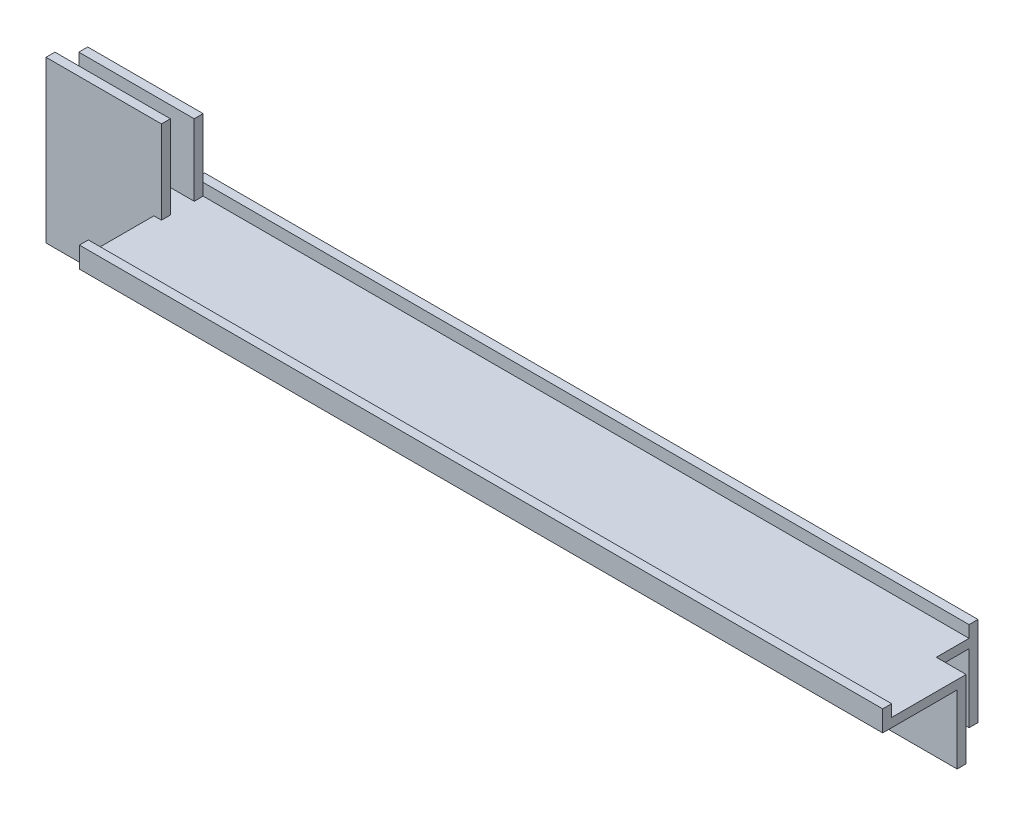
ISO-10303-21;
HEADER;
FILE_DESCRIPTION(('STEP AP214'),'2;1');
FILE_NAME('part.step','',(''),(''),'','','');
FILE_SCHEMA(('AUTOMOTIVE_DESIGN { 1 0 10303 214 1 1 1 1 }'));
ENDSEC;
DATA;
#1=APPLICATION_CONTEXT('core data for automotive mechanical design processes');
#2=APPLICATION_PROTOCOL_DEFINITION('international standard','automotive_design',2000,#1);
#3=PRODUCT_CONTEXT('',#1,'mechanical');
#4=PRODUCT('Part','Part','',(#3));
#5=PRODUCT_RELATED_PRODUCT_CATEGORY('part','',(#4));
#6=PRODUCT_DEFINITION_FORMATION('','',#4);
#7=PRODUCT_DEFINITION_CONTEXT('part definition',#1,'design');
#8=PRODUCT_DEFINITION('design','',#6,#7);
#9=PRODUCT_DEFINITION_SHAPE('','',#8);
#10=(LENGTH_UNIT() NAMED_UNIT(*) SI_UNIT(.MILLI.,.METRE.));
#11=(NAMED_UNIT(*) PLANE_ANGLE_UNIT() SI_UNIT($,.RADIAN.));
#12=(NAMED_UNIT(*) SI_UNIT($,.STERADIAN.) SOLID_ANGLE_UNIT());
#13=UNCERTAINTY_MEASURE_WITH_UNIT(LENGTH_MEASURE(1.E-05),#10,'distance_accuracy_value','');
#14=(GEOMETRIC_REPRESENTATION_CONTEXT(3) GLOBAL_UNCERTAINTY_ASSIGNED_CONTEXT((#13)) GLOBAL_UNIT_ASSIGNED_CONTEXT((#10,
#11,#12)) REPRESENTATION_CONTEXT('',''));
#15=CARTESIAN_POINT('',(0.,0.,0.));
#16=DIRECTION('',(0.,0.,1.));
#17=DIRECTION('',(1.,0.,0.));
#18=AXIS2_PLACEMENT_3D('',#15,#16,#17);
#19=CARTESIAN_POINT('',(24.45893,0.,3.));
#20=DIRECTION('',(0.,0.,1.));
#21=DIRECTION('',(1.,0.,0.));
#22=AXIS2_PLACEMENT_3D('',#19,#20,#21);
#23=PLANE('',#22);
#24=DIRECTION('',(-1.,0.,0.));
#25=VECTOR('',#24,1.);
#26=CARTESIAN_POINT('',(24.45893,0.,3.));
#27=LINE('',#26,#25);
#28=CARTESIAN_POINT('',(-258.42214,0.,3.));
#29=VERTEX_POINT('',#28);
#30=CARTESIAN_POINT('',(-277.80107,0.,3.));
#31=VERTEX_POINT('',#30);
#32=EDGE_CURVE('E325',#29,#31,#27,.T.);
#33=ORIENTED_EDGE('',*,*,#32,.F.);
#34=DIRECTION('',(0.,1.,0.));
#35=VECTOR('',#34,1.);
#36=CARTESIAN_POINT('',(-258.42214,0.,3.));
#37=LINE('',#36,#35);
#38=CARTESIAN_POINT('',(-258.42214,12.,3.));
#39=VERTEX_POINT('',#38);
#40=EDGE_CURVE('E324',#29,#39,#37,.T.);
#41=ORIENTED_EDGE('',*,*,#40,.T.);
#42=DIRECTION('',(-1.,0.,0.));
#43=VECTOR('',#42,1.);
#44=CARTESIAN_POINT('',(24.45893,12.,3.));
#45=LINE('',#44,#43);
#46=CARTESIAN_POINT('',(-277.80107,12.,3.));
#47=VERTEX_POINT('',#46);
#48=EDGE_CURVE('E168',#39,#47,#45,.T.);
#49=ORIENTED_EDGE('',*,*,#48,.T.);
#50=DIRECTION('',(0.,1.,0.));
#51=VECTOR('',#50,1.);
#52=CARTESIAN_POINT('',(-277.80107,0.,3.));
#53=LINE('',#52,#51);
#54=EDGE_CURVE('E321',#31,#47,#53,.T.);
#55=ORIENTED_EDGE('',*,*,#54,.F.);
#56=EDGE_LOOP('',(#33,#41,#49,#55));
#57=FACE_BOUND('',#56,.T.);
#58=ADVANCED_FACE('F160',(#57),#23,.T.);
#59=CARTESIAN_POINT('',(24.45893,0.,7.));
#60=DIRECTION('',(0.,1.,0.));
#61=DIRECTION('',(0.,0.,1.));
#62=AXIS2_PLACEMENT_3D('',#59,#60,#61);
#63=PLANE('',#62);
#64=DIRECTION('',(-1.,0.,0.));
#65=VECTOR('',#64,1.);
#66=CARTESIAN_POINT('',(-259.69214,0.,7.));
#67=LINE('',#66,#65);
#68=CARTESIAN_POINT('',(-124.84607,0.,7.));
#69=VERTEX_POINT('',#68);
#70=CARTESIAN_POINT('',(-129.84607,0.,7.));
#71=VERTEX_POINT('',#70);
#72=EDGE_CURVE('E368',#69,#71,#67,.T.);
#73=ORIENTED_EDGE('',*,*,#72,.T.);
#74=DIRECTION('',(0.,0.,-1.));
#75=VECTOR('',#74,1.);
#76=CARTESIAN_POINT('',(-129.84607,0.,0.));
#77=LINE('',#76,#75);
#78=CARTESIAN_POINT('',(-129.84607,0.,1.5));
#79=VERTEX_POINT('',#78);
#80=EDGE_CURVE('E440',#71,#79,#77,.T.);
#81=ORIENTED_EDGE('',*,*,#80,.T.);
#82=DIRECTION('',(1.,0.,0.));
#83=VECTOR('',#82,1.);
#84=CARTESIAN_POINT('',(-259.69214,0.,1.5));
#85=LINE('',#84,#83);
#86=CARTESIAN_POINT('',(-258.42214,0.,1.5));
#87=VERTEX_POINT('',#86);
#88=EDGE_CURVE('E331',#87,#79,#85,.T.);
#89=ORIENTED_EDGE('',*,*,#88,.F.);
#90=DIRECTION('',(0.,0.,-1.));
#91=VECTOR('',#90,1.);
#92=CARTESIAN_POINT('',(-258.42214,0.,0.));
#93=LINE('',#92,#91);
#94=EDGE_CURVE('E356',#29,#87,#93,.T.);
#95=ORIENTED_EDGE('',*,*,#94,.F.);
#96=ORIENTED_EDGE('',*,*,#32,.T.);
#97=DIRECTION('',(0.,0.,-1.));
#98=VECTOR('',#97,1.);
#99=CARTESIAN_POINT('',(-277.80107,0.,0.));
#100=LINE('',#99,#98);
#101=CARTESIAN_POINT('',(-277.80107,0.,7.));
#102=VERTEX_POINT('',#101);
#103=EDGE_CURVE('E330',#102,#31,#100,.T.);
#104=ORIENTED_EDGE('',*,*,#103,.F.);
#105=DIRECTION('',(-1.,0.,0.));
#106=VECTOR('',#105,1.);
#107=CARTESIAN_POINT('',(24.45893,0.,7.));
#108=LINE('',#107,#106);
#109=CARTESIAN_POINT('',(-258.42214,0.,7.));
#110=VERTEX_POINT('',#109);
#111=EDGE_CURVE('E396',#110,#102,#108,.T.);
#112=ORIENTED_EDGE('',*,*,#111,.F.);
#113=CARTESIAN_POINT('',(-258.42214,0.,8.5));
#114=VERTEX_POINT('',#113);
#115=EDGE_CURVE('E353',#114,#110,#93,.T.);
#116=ORIENTED_EDGE('',*,*,#115,.F.);
#117=DIRECTION('',(-1.,0.,0.));
#118=VECTOR('',#117,1.);
#119=CARTESIAN_POINT('',(-259.69214,0.,8.5));
#120=LINE('',#119,#118);
#121=CARTESIAN_POINT('',(-259.69214,0.,8.5));
#122=VERTEX_POINT('',#121);
#123=EDGE_CURVE('E419',#114,#122,#120,.T.);
#124=ORIENTED_EDGE('',*,*,#123,.T.);
#125=DIRECTION('',(0.,0.,-1.));
#126=VECTOR('',#125,1.);
#127=CARTESIAN_POINT('',(-259.69214,0.,0.));
#128=LINE('',#127,#126);
#129=CARTESIAN_POINT('',(-259.69214,0.,19.5));
#130=VERTEX_POINT('',#129);
#131=EDGE_CURVE('E357',#130,#122,#128,.T.);
#132=ORIENTED_EDGE('',*,*,#131,.F.);
#133=DIRECTION('',(1.,0.,0.));
#134=VECTOR('',#133,1.);
#135=CARTESIAN_POINT('',(-259.69214,0.,19.5));
#136=LINE('',#135,#134);
#137=CARTESIAN_POINT('',(-124.84607,0.,19.5));
#138=VERTEX_POINT('',#137);
#139=EDGE_CURVE('E478',#130,#138,#136,.T.);
#140=ORIENTED_EDGE('',*,*,#139,.T.);
#141=DIRECTION('',(0.,0.,-1.));
#142=VECTOR('',#141,1.);
#143=CARTESIAN_POINT('',(-124.84607,0.,-2.67337878025385E-13));
#144=LINE('',#143,#142);
#145=EDGE_CURVE('E373',#138,#69,#144,.T.);
#146=ORIENTED_EDGE('',*,*,#145,.T.);
#147=EDGE_LOOP('',(#73,#81,#89,#95,#96,#104,#112,#116,#124,#132,#140,#146));
#148=FACE_BOUND('',#147,.T.);
#149=ADVANCED_FACE('F439',(#148),#63,.T.);
#150=CARTESIAN_POINT('',(24.45893,14.,7.));
#151=DIRECTION('',(0.,0.,-1.));
#152=DIRECTION('',(0.,1.,0.));
#153=AXIS2_PLACEMENT_3D('',#150,#151,#152);
#154=PLANE('',#153);
#155=DIRECTION('',(-1.,0.,0.));
#156=VECTOR('',#155,1.);
#157=CARTESIAN_POINT('',(24.45893,14.,7.));
#158=LINE('',#157,#156);
#159=CARTESIAN_POINT('',(-258.42214,14.,7.));
#160=VERTEX_POINT('',#159);
#161=CARTESIAN_POINT('',(-277.80107,14.,7.));
#162=VERTEX_POINT('',#161);
#163=EDGE_CURVE('E390',#160,#162,#158,.T.);
#164=ORIENTED_EDGE('',*,*,#163,.F.);
#165=DIRECTION('',(0.,-1.,0.));
#166=VECTOR('',#165,1.);
#167=CARTESIAN_POINT('',(-258.42214,0.,7.));
#168=LINE('',#167,#166);
#169=EDGE_CURVE('E348',#160,#110,#168,.T.);
#170=ORIENTED_EDGE('',*,*,#169,.T.);
#171=ORIENTED_EDGE('',*,*,#111,.T.);
#172=DIRECTION('',(0.,-1.,0.));
#173=VECTOR('',#172,1.);
#174=CARTESIAN_POINT('',(-277.80107,0.,7.));
#175=LINE('',#174,#173);
#176=EDGE_CURVE('E336',#162,#102,#175,.T.);
#177=ORIENTED_EDGE('',*,*,#176,.F.);
#178=EDGE_LOOP('',(#164,#170,#171,#177));
#179=FACE_BOUND('',#178,.T.);
#180=ADVANCED_FACE('F405',(#179),#154,.T.);
#181=CARTESIAN_POINT('',(24.45893,14.,19.5));
#182=DIRECTION('',(0.,1.,0.));
#183=DIRECTION('',(0.,0.,1.));
#184=AXIS2_PLACEMENT_3D('',#181,#182,#183);
#185=PLANE('',#184);
#186=DIRECTION('',(1.,0.,0.));
#187=VECTOR('',#186,1.);
#188=CARTESIAN_POINT('',(-259.69214,14.,8.5));
#189=LINE('',#188,#187);
#190=CARTESIAN_POINT('',(-277.80107,14.,8.5));
#191=VERTEX_POINT('',#190);
#192=CARTESIAN_POINT('',(-258.42214,14.,8.5));
#193=VERTEX_POINT('',#192);
#194=EDGE_CURVE('E346',#191,#193,#189,.T.);
#195=ORIENTED_EDGE('',*,*,#194,.T.);
#196=DIRECTION('',(0.,0.,1.));
#197=VECTOR('',#196,1.);
#198=CARTESIAN_POINT('',(-258.42214,14.,0.));
#199=LINE('',#198,#197);
#200=EDGE_CURVE('E339',#160,#193,#199,.T.);
#201=ORIENTED_EDGE('',*,*,#200,.F.);
#202=ORIENTED_EDGE('',*,*,#163,.T.);
#203=DIRECTION('',(0.,0.,-1.));
#204=VECTOR('',#203,1.);
#205=CARTESIAN_POINT('',(-277.80107,14.,0.));
#206=LINE('',#205,#204);
#207=EDGE_CURVE('E343',#191,#162,#206,.T.);
#208=ORIENTED_EDGE('',*,*,#207,.F.);
#209=EDGE_LOOP('',(#195,#201,#202,#208));
#210=FACE_BOUND('',#209,.T.);
#211=ADVANCED_FACE('F400',(#210),#185,.T.);
#212=CARTESIAN_POINT('',(-259.69214,0.,21.));
#213=DIRECTION('',(0.,0.,-1.));
#214=DIRECTION('',(-1.,0.,0.));
#215=AXIS2_PLACEMENT_3D('',#212,#213,#214);
#216=PLANE('',#215);
#217=DIRECTION('',(1.,0.,0.));
#218=VECTOR('',#217,1.);
#219=CARTESIAN_POINT('',(-259.69214,-1.5,21.));
#220=LINE('',#219,#218);
#221=CARTESIAN_POINT('',(-259.69214,-1.5,21.));
#222=VERTEX_POINT('',#221);
#223=CARTESIAN_POINT('',(-124.84607,-1.5,21.));
#224=VERTEX_POINT('',#223);
#225=EDGE_CURVE('E493',#222,#224,#220,.T.);
#226=ORIENTED_EDGE('',*,*,#225,.T.);
#227=DIRECTION('',(0.,1.,0.));
#228=VECTOR('',#227,1.);
#229=CARTESIAN_POINT('',(-124.84607,0.,21.));
#230=LINE('',#229,#228);
#231=CARTESIAN_POINT('',(-124.84607,2.,21.));
#232=VERTEX_POINT('',#231);
#233=EDGE_CURVE('E464',#224,#232,#230,.T.);
#234=ORIENTED_EDGE('',*,*,#233,.T.);
#235=DIRECTION('',(1.,0.,0.));
#236=VECTOR('',#235,1.);
#237=CARTESIAN_POINT('',(-259.69214,2.,21.));
#238=LINE('',#237,#236);
#239=CARTESIAN_POINT('',(-259.69214,2.,21.));
#240=VERTEX_POINT('',#239);
#241=EDGE_CURVE('E487',#240,#232,#238,.T.);
#242=ORIENTED_EDGE('',*,*,#241,.F.);
#243=DIRECTION('',(0.,1.,0.));
#244=VECTOR('',#243,1.);
#245=CARTESIAN_POINT('',(-259.69214,0.,21.));
#246=LINE('',#245,#244);
#247=EDGE_CURVE('E527',#222,#240,#246,.T.);
#248=ORIENTED_EDGE('',*,*,#247,.F.);
#249=EDGE_LOOP('',(#226,#234,#242,#248));
#250=FACE_BOUND('',#249,.T.);
#251=ADVANCED_FACE('F572',(#250),#216,.F.);
#252=CARTESIAN_POINT('',(-259.69214,2.,0.));
#253=DIRECTION('',(0.,-1.,0.));
#254=DIRECTION('',(0.,0.,-1.));
#255=AXIS2_PLACEMENT_3D('',#252,#253,#254);
#256=PLANE('',#255);
#257=ORIENTED_EDGE('',*,*,#241,.T.);
#258=DIRECTION('',(0.,0.,-1.));
#259=VECTOR('',#258,1.);
#260=CARTESIAN_POINT('',(-124.84607,2.,-2.67337878025385E-13));
#261=LINE('',#260,#259);
#262=CARTESIAN_POINT('',(-124.84607,2.,19.5));
#263=VERTEX_POINT('',#262);
#264=EDGE_CURVE('E466',#232,#263,#261,.T.);
#265=ORIENTED_EDGE('',*,*,#264,.T.);
#266=DIRECTION('',(1.,0.,0.));
#267=VECTOR('',#266,1.);
#268=CARTESIAN_POINT('',(-259.69214,2.,19.5));
#269=LINE('',#268,#267);
#270=CARTESIAN_POINT('',(-259.69214,2.,19.5));
#271=VERTEX_POINT('',#270);
#272=EDGE_CURVE('E480',#271,#263,#269,.T.);
#273=ORIENTED_EDGE('',*,*,#272,.F.);
#274=DIRECTION('',(0.,0.,-1.));
#275=VECTOR('',#274,1.);
#276=CARTESIAN_POINT('',(-259.69214,2.,0.));
#277=LINE('',#276,#275);
#278=EDGE_CURVE('E529',#240,#271,#277,.T.);
#279=ORIENTED_EDGE('',*,*,#278,.F.);
#280=EDGE_LOOP('',(#257,#265,#273,#279));
#281=FACE_BOUND('',#280,.T.);
#282=ADVANCED_FACE('F570',(#281),#256,.F.);
#283=CARTESIAN_POINT('',(-259.69214,0.,19.5));
#284=DIRECTION('',(0.,0.,-1.));
#285=DIRECTION('',(-1.,0.,0.));
#286=AXIS2_PLACEMENT_3D('',#283,#284,#285);
#287=PLANE('',#286);
#288=DIRECTION('',(0.,1.,0.));
#289=VECTOR('',#288,1.);
#290=CARTESIAN_POINT('',(-124.84607,0.,19.5));
#291=LINE('',#290,#289);
#292=EDGE_CURVE('E377',#138,#263,#291,.T.);
#293=ORIENTED_EDGE('',*,*,#292,.F.);
#294=ORIENTED_EDGE('',*,*,#139,.F.);
#295=DIRECTION('',(0.,1.,0.));
#296=VECTOR('',#295,1.);
#297=CARTESIAN_POINT('',(-259.69214,0.,19.5));
#298=LINE('',#297,#296);
#299=EDGE_CURVE('E531',#130,#271,#298,.T.);
#300=ORIENTED_EDGE('',*,*,#299,.T.);
#301=ORIENTED_EDGE('',*,*,#272,.T.);
#302=EDGE_LOOP('',(#293,#294,#300,#301));
#303=FACE_BOUND('',#302,.T.);
#304=ADVANCED_FACE('F476',(#303),#287,.T.);
#305=CARTESIAN_POINT('',(-259.69214,0.,0.));
#306=DIRECTION('',(1.,0.,0.));
#307=DIRECTION('',(0.,0.,-1.));
#308=AXIS2_PLACEMENT_3D('',#305,#306,#307);
#309=PLANE('',#308);
#310=ORIENTED_EDGE('',*,*,#131,.T.);
#311=DIRECTION('',(0.,-1.,0.));
#312=VECTOR('',#311,1.);
#313=CARTESIAN_POINT('',(-259.69214,0.,8.5));
#314=LINE('',#313,#312);
#315=CARTESIAN_POINT('',(-259.69214,-1.5,8.5));
#316=VERTEX_POINT('',#315);
#317=EDGE_CURVE('E423',#122,#316,#314,.T.);
#318=ORIENTED_EDGE('',*,*,#317,.T.);
#319=DIRECTION('',(0.,0.,1.));
#320=VECTOR('',#319,1.);
#321=CARTESIAN_POINT('',(-259.69214,-1.5,0.));
#322=LINE('',#321,#320);
#323=EDGE_CURVE('E525',#316,#222,#322,.T.);
#324=ORIENTED_EDGE('',*,*,#323,.T.);
#325=ORIENTED_EDGE('',*,*,#247,.T.);
#326=ORIENTED_EDGE('',*,*,#278,.T.);
#327=ORIENTED_EDGE('',*,*,#299,.F.);
#328=EDGE_LOOP('',(#310,#318,#324,#325,#326,#327));
#329=FACE_BOUND('',#328,.T.);
#330=ADVANCED_FACE('F567',(#329),#309,.F.);
#331=CARTESIAN_POINT('',(-259.69214,-1.5,0.));
#332=DIRECTION('',(0.,1.,0.));
#333=DIRECTION('',(0.,0.,1.));
#334=AXIS2_PLACEMENT_3D('',#331,#332,#333);
#335=PLANE('',#334);
#336=DIRECTION('',(1.,0.,0.));
#337=VECTOR('',#336,1.);
#338=CARTESIAN_POINT('',(-259.69214,-1.5,8.5));
#339=LINE('',#338,#337);
#340=CARTESIAN_POINT('',(-124.84607,-1.5,8.5));
#341=VERTEX_POINT('',#340);
#342=EDGE_CURVE('E496',#316,#341,#339,.T.);
#343=ORIENTED_EDGE('',*,*,#342,.T.);
#344=DIRECTION('',(0.,0.,1.));
#345=VECTOR('',#344,1.);
#346=CARTESIAN_POINT('',(-124.84607,-1.5,-2.67467982286083E-13));
#347=LINE('',#346,#345);
#348=EDGE_CURVE('E461',#341,#224,#347,.T.);
#349=ORIENTED_EDGE('',*,*,#348,.T.);
#350=ORIENTED_EDGE('',*,*,#225,.F.);
#351=ORIENTED_EDGE('',*,*,#323,.F.);
#352=EDGE_LOOP('',(#343,#349,#350,#351));
#353=FACE_BOUND('',#352,.T.);
#354=ADVANCED_FACE('F563',(#353),#335,.F.);
#355=CARTESIAN_POINT('',(-124.84607,-13.,2.47512466871364E-13));
#356=DIRECTION('',(-1.,0.,0.));
#357=DIRECTION('',(0.,0.,1.));
#358=AXIS2_PLACEMENT_3D('',#355,#356,#357);
#359=PLANE('',#358);
#360=DIRECTION('',(0.,0.,1.));
#361=VECTOR('',#360,1.);
#362=CARTESIAN_POINT('',(-124.84607,-13.,2.47512466871364E-13));
#363=LINE('',#362,#361);
#364=CARTESIAN_POINT('',(-124.84607,-13.,7.));
#365=VERTEX_POINT('',#364);
#366=CARTESIAN_POINT('',(-124.84607,-13.,8.5));
#367=VERTEX_POINT('',#366);
#368=EDGE_CURVE('E383',#365,#367,#363,.T.);
#369=ORIENTED_EDGE('',*,*,#368,.F.);
#370=DIRECTION('',(0.,1.,0.));
#371=VECTOR('',#370,1.);
#372=CARTESIAN_POINT('',(-124.84607,-13.,7.));
#373=LINE('',#372,#371);
#374=EDGE_CURVE('E182',#365,#69,#373,.T.);
#375=ORIENTED_EDGE('',*,*,#374,.T.);
#376=ORIENTED_EDGE('',*,*,#145,.F.);
#377=ORIENTED_EDGE('',*,*,#292,.T.);
#378=ORIENTED_EDGE('',*,*,#264,.F.);
#379=ORIENTED_EDGE('',*,*,#233,.F.);
#380=ORIENTED_EDGE('',*,*,#348,.F.);
#381=DIRECTION('',(0.,1.,0.));
#382=VECTOR('',#381,1.);
#383=CARTESIAN_POINT('',(-124.84607,0.,8.5));
#384=LINE('',#383,#382);
#385=EDGE_CURVE('E370',#367,#341,#384,.T.);
#386=ORIENTED_EDGE('',*,*,#385,.F.);
#387=EDGE_LOOP('',(#369,#375,#376,#377,#378,#379,#380,#386));
#388=FACE_BOUND('',#387,.T.);
#389=ADVANCED_FACE('F473',(#388),#359,.F.);
#390=DIRECTION('',(0.,1.,0.));
#391=VECTOR('',#390,1.);
#392=CARTESIAN_POINT('',(-259.69214,0.,1.5));
#393=LINE('',#392,#391);
#394=CARTESIAN_POINT('',(-259.69214,-13.,1.5));
#395=VERTEX_POINT('',#394);
#396=CARTESIAN_POINT('',(-259.69214,-1.5,1.5));
#397=VERTEX_POINT('',#396);
#398=EDGE_CURVE('E522',#395,#397,#393,.T.);
#399=ORIENTED_EDGE('',*,*,#398,.T.);
#400=DIRECTION('',(0.,1.,0.));
#401=VECTOR('',#400,1.);
#402=CARTESIAN_POINT('',(-259.69214,0.,1.5));
#403=LINE('',#402,#401);
#404=CARTESIAN_POINT('',(-259.69214,2.,1.5));
#405=VERTEX_POINT('',#404);
#406=EDGE_CURVE('E483',#397,#405,#403,.T.);
#407=ORIENTED_EDGE('',*,*,#406,.T.);
#408=DIRECTION('',(0.,0.,1.));
#409=VECTOR('',#408,1.);
#410=CARTESIAN_POINT('',(-259.69214,2.,0.));
#411=LINE('',#410,#409);
#412=CARTESIAN_POINT('',(-259.69214,2.,0.));
#413=VERTEX_POINT('',#412);
#414=EDGE_CURVE('E485',#413,#405,#411,.T.);
#415=ORIENTED_EDGE('',*,*,#414,.F.);
#416=DIRECTION('',(0.,-1.,0.));
#417=VECTOR('',#416,1.);
#418=CARTESIAN_POINT('',(-259.69214,0.,0.));
#419=LINE('',#418,#417);
#420=CARTESIAN_POINT('',(-259.69214,-13.,0.));
#421=VERTEX_POINT('',#420);
#422=EDGE_CURVE('E518',#413,#421,#419,.T.);
#423=ORIENTED_EDGE('',*,*,#422,.T.);
#424=DIRECTION('',(0.,0.,1.));
#425=VECTOR('',#424,1.);
#426=CARTESIAN_POINT('',(-259.69214,-13.,0.));
#427=LINE('',#426,#425);
#428=EDGE_CURVE('E520',#421,#395,#427,.T.);
#429=ORIENTED_EDGE('',*,*,#428,.T.);
#430=EDGE_LOOP('',(#399,#407,#415,#423,#429));
#431=FACE_BOUND('',#430,.T.);
#432=ADVANCED_FACE('F553',(#431),#309,.F.);
#433=CARTESIAN_POINT('',(-258.42214,0.,0.));
#434=DIRECTION('',(-1.,0.,0.));
#435=DIRECTION('',(0.,0.,1.));
#436=AXIS2_PLACEMENT_3D('',#433,#434,#435);
#437=PLANE('',#436);
#438=DIRECTION('',(0.,1.,0.));
#439=VECTOR('',#438,1.);
#440=CARTESIAN_POINT('',(-258.42214,0.,1.5));
#441=LINE('',#440,#439);
#442=CARTESIAN_POINT('',(-258.42214,2.,1.5));
#443=VERTEX_POINT('',#442);
#444=CARTESIAN_POINT('',(-258.42214,11.9985343973785,1.5));
#445=VERTEX_POINT('',#444);
#446=EDGE_CURVE('E358',#443,#445,#441,.T.);
#447=ORIENTED_EDGE('',*,*,#446,.T.);
#448=DIRECTION('',(0.,0.000977067947953824,0.999999522668999));
#449=VECTOR('',#448,1.);
#450=CARTESIAN_POINT('',(-258.42214,11.997057341614,-0.0117219457935033));
#451=LINE('',#450,#449);
#452=EDGE_CURVE('E352',#445,#39,#451,.T.);
#453=ORIENTED_EDGE('',*,*,#452,.T.);
#454=ORIENTED_EDGE('',*,*,#40,.F.);
#455=ORIENTED_EDGE('',*,*,#94,.T.);
#456=EDGE_CURVE('E362',#87,#443,#441,.T.);
#457=ORIENTED_EDGE('',*,*,#456,.T.);
#458=EDGE_LOOP('',(#447,#453,#454,#455,#457));
#459=FACE_BOUND('',#458,.T.);
#460=ADVANCED_FACE('F429',(#459),#437,.F.);
#461=CARTESIAN_POINT('',(-259.69214,-13.,0.));
#462=DIRECTION('',(0.,1.,0.));
#463=DIRECTION('',(0.,0.,1.));
#464=AXIS2_PLACEMENT_3D('',#461,#462,#463);
#465=PLANE('',#464);
#466=DIRECTION('',(1.,0.,0.));
#467=VECTOR('',#466,1.);
#468=CARTESIAN_POINT('',(-259.69214,-13.,7.));
#469=LINE('',#468,#467);
#470=CARTESIAN_POINT('',(-277.80107,-13.,7.));
#471=VERTEX_POINT('',#470);
#472=EDGE_CURVE('E500',#471,#365,#469,.T.);
#473=ORIENTED_EDGE('',*,*,#472,.T.);
#474=ORIENTED_EDGE('',*,*,#368,.T.);
#475=DIRECTION('',(1.,0.,0.));
#476=VECTOR('',#475,1.);
#477=CARTESIAN_POINT('',(-259.69214,-13.,8.5));
#478=LINE('',#477,#476);
#479=CARTESIAN_POINT('',(-277.80107,-13.,8.5));
#480=VERTEX_POINT('',#479);
#481=EDGE_CURVE('E413',#480,#367,#478,.T.);
#482=ORIENTED_EDGE('',*,*,#481,.F.);
#483=DIRECTION('',(0.,0.,-1.));
#484=VECTOR('',#483,1.);
#485=CARTESIAN_POINT('',(-277.80107,-13.,0.));
#486=LINE('',#485,#484);
#487=EDGE_CURVE('E365',#480,#471,#486,.T.);
#488=ORIENTED_EDGE('',*,*,#487,.T.);
#489=EDGE_LOOP('',(#473,#474,#482,#488));
#490=FACE_BOUND('',#489,.T.);
#491=ADVANCED_FACE('F559',(#490),#465,.F.);
#492=CARTESIAN_POINT('',(-259.69214,0.,1.5));
#493=DIRECTION('',(0.,0.,-1.));
#494=DIRECTION('',(-1.,0.,0.));
#495=AXIS2_PLACEMENT_3D('',#492,#493,#494);
#496=PLANE('',#495);
#497=ORIENTED_EDGE('',*,*,#88,.T.);
#498=DIRECTION('',(0.,1.,0.));
#499=VECTOR('',#498,1.);
#500=CARTESIAN_POINT('',(-129.84607,0.,1.5));
#501=LINE('',#500,#499);
#502=CARTESIAN_POINT('',(-129.84607,2.,1.5));
#503=VERTEX_POINT('',#502);
#504=EDGE_CURVE('E443',#79,#503,#501,.T.);
#505=ORIENTED_EDGE('',*,*,#504,.T.);
#506=DIRECTION('',(1.,0.,0.));
#507=VECTOR('',#506,1.);
#508=CARTESIAN_POINT('',(-259.69214,2.,1.5));
#509=LINE('',#508,#507);
#510=EDGE_CURVE('E436',#443,#503,#509,.T.);
#511=ORIENTED_EDGE('',*,*,#510,.F.);
#512=ORIENTED_EDGE('',*,*,#456,.F.);
#513=EDGE_LOOP('',(#497,#505,#511,#512));
#514=FACE_BOUND('',#513,.T.);
#515=ADVANCED_FACE('F433',(#514),#496,.F.);
#516=CARTESIAN_POINT('',(-259.69214,2.,0.));
#517=DIRECTION('',(0.,1.,0.));
#518=DIRECTION('',(0.,0.,1.));
#519=AXIS2_PLACEMENT_3D('',#516,#517,#518);
#520=PLANE('',#519);
#521=DIRECTION('',(0.,0.,1.));
#522=VECTOR('',#521,1.);
#523=CARTESIAN_POINT('',(-129.84607,2.,0.));
#524=LINE('',#523,#522);
#525=CARTESIAN_POINT('',(-129.84607,2.,0.));
#526=VERTEX_POINT('',#525);
#527=EDGE_CURVE('E447',#526,#503,#524,.T.);
#528=ORIENTED_EDGE('',*,*,#527,.F.);
#529=DIRECTION('',(1.,0.,0.));
#530=VECTOR('',#529,1.);
#531=CARTESIAN_POINT('',(-259.69214,2.,0.));
#532=LINE('',#531,#530);
#533=EDGE_CURVE('E512',#413,#526,#532,.T.);
#534=ORIENTED_EDGE('',*,*,#533,.F.);
#535=ORIENTED_EDGE('',*,*,#414,.T.);
#536=EDGE_CURVE('E334',#405,#443,#509,.T.);
#537=ORIENTED_EDGE('',*,*,#536,.T.);
#538=ORIENTED_EDGE('',*,*,#510,.T.);
#539=EDGE_LOOP('',(#528,#534,#535,#537,#538));
#540=FACE_BOUND('',#539,.T.);
#541=ADVANCED_FACE('F599',(#540),#520,.T.);
#542=CARTESIAN_POINT('',(-259.69214,0.,0.));
#543=DIRECTION('',(0.,0.,1.));
#544=DIRECTION('',(0.,-1.,0.));
#545=AXIS2_PLACEMENT_3D('',#542,#543,#544);
#546=PLANE('',#545);
#547=ORIENTED_EDGE('',*,*,#533,.T.);
#548=DIRECTION('',(0.,-1.,0.));
#549=VECTOR('',#548,1.);
#550=CARTESIAN_POINT('',(-129.84607,0.,0.));
#551=LINE('',#550,#549);
#552=CARTESIAN_POINT('',(-129.84607,-13.,0.));
#553=VERTEX_POINT('',#552);
#554=EDGE_CURVE('E449',#526,#553,#551,.T.);
#555=ORIENTED_EDGE('',*,*,#554,.T.);
#556=DIRECTION('',(1.,0.,0.));
#557=VECTOR('',#556,1.);
#558=CARTESIAN_POINT('',(-259.69214,-13.,0.));
#559=LINE('',#558,#557);
#560=EDGE_CURVE('E510',#421,#553,#559,.T.);
#561=ORIENTED_EDGE('',*,*,#560,.F.);
#562=ORIENTED_EDGE('',*,*,#422,.F.);
#563=EDGE_LOOP('',(#547,#555,#561,#562));
#564=FACE_BOUND('',#563,.T.);
#565=ADVANCED_FACE('F596',(#564),#546,.F.);
#566=CARTESIAN_POINT('',(-259.69214,-13.,0.));
#567=DIRECTION('',(0.,1.,0.));
#568=DIRECTION('',(0.,0.,1.));
#569=AXIS2_PLACEMENT_3D('',#566,#567,#568);
#570=PLANE('',#569);
#571=ORIENTED_EDGE('',*,*,#560,.T.);
#572=DIRECTION('',(0.,0.,1.));
#573=VECTOR('',#572,1.);
#574=CARTESIAN_POINT('',(-129.84607,-13.,0.));
#575=LINE('',#574,#573);
#576=CARTESIAN_POINT('',(-129.84607,-13.,1.5));
#577=VERTEX_POINT('',#576);
#578=EDGE_CURVE('E378',#553,#577,#575,.T.);
#579=ORIENTED_EDGE('',*,*,#578,.T.);
#580=DIRECTION('',(1.,0.,0.));
#581=VECTOR('',#580,1.);
#582=CARTESIAN_POINT('',(-259.69214,-13.,1.5));
#583=LINE('',#582,#581);
#584=EDGE_CURVE('E508',#395,#577,#583,.T.);
#585=ORIENTED_EDGE('',*,*,#584,.F.);
#586=ORIENTED_EDGE('',*,*,#428,.F.);
#587=EDGE_LOOP('',(#571,#579,#585,#586));
#588=FACE_BOUND('',#587,.T.);
#589=ADVANCED_FACE('F593',(#588),#570,.F.);
#590=CARTESIAN_POINT('',(-259.69214,0.,1.5));
#591=DIRECTION('',(0.,0.,-1.));
#592=DIRECTION('',(-1.,0.,0.));
#593=AXIS2_PLACEMENT_3D('',#590,#591,#592);
#594=PLANE('',#593);
#595=ORIENTED_EDGE('',*,*,#584,.T.);
#596=DIRECTION('',(0.,1.,0.));
#597=VECTOR('',#596,1.);
#598=CARTESIAN_POINT('',(-129.84607,0.,1.5));
#599=LINE('',#598,#597);
#600=CARTESIAN_POINT('',(-129.84607,-1.5,1.5));
#601=VERTEX_POINT('',#600);
#602=EDGE_CURVE('E455',#577,#601,#599,.T.);
#603=ORIENTED_EDGE('',*,*,#602,.T.);
#604=DIRECTION('',(1.,0.,0.));
#605=VECTOR('',#604,1.);
#606=CARTESIAN_POINT('',(-259.69214,-1.5,1.5));
#607=LINE('',#606,#605);
#608=EDGE_CURVE('E505',#397,#601,#607,.T.);
#609=ORIENTED_EDGE('',*,*,#608,.F.);
#610=ORIENTED_EDGE('',*,*,#398,.F.);
#611=EDGE_LOOP('',(#595,#603,#609,#610));
#612=FACE_BOUND('',#611,.T.);
#613=ADVANCED_FACE('F556',(#612),#594,.F.);
#614=CARTESIAN_POINT('',(-259.69214,-1.5,0.));
#615=DIRECTION('',(0.,1.,0.));
#616=DIRECTION('',(0.,0.,1.));
#617=AXIS2_PLACEMENT_3D('',#614,#615,#616);
#618=PLANE('',#617);
#619=ORIENTED_EDGE('',*,*,#608,.T.);
#620=DIRECTION('',(0.,0.,1.));
#621=VECTOR('',#620,1.);
#622=CARTESIAN_POINT('',(-129.84607,-1.5,0.));
#623=LINE('',#622,#621);
#624=CARTESIAN_POINT('',(-129.84607,-1.5,7.));
#625=VERTEX_POINT('',#624);
#626=EDGE_CURVE('E374',#601,#625,#623,.T.);
#627=ORIENTED_EDGE('',*,*,#626,.T.);
#628=DIRECTION('',(1.,0.,0.));
#629=VECTOR('',#628,1.);
#630=CARTESIAN_POINT('',(-259.69214,-1.5,7.));
#631=LINE('',#630,#629);
#632=CARTESIAN_POINT('',(-277.80107,-1.5,7.));
#633=VERTEX_POINT('',#632);
#634=EDGE_CURVE('E502',#633,#625,#631,.T.);
#635=ORIENTED_EDGE('',*,*,#634,.F.);
#636=DIRECTION('',(0.,0.,-1.));
#637=VECTOR('',#636,1.);
#638=CARTESIAN_POINT('',(-277.80107,-1.5,0.));
#639=LINE('',#638,#637);
#640=CARTESIAN_POINT('',(-277.80107,-1.5,1.5));
#641=VERTEX_POINT('',#640);
#642=EDGE_CURVE('E369',#633,#641,#639,.T.);
#643=ORIENTED_EDGE('',*,*,#642,.T.);
#644=DIRECTION('',(-1.,0.,0.));
#645=VECTOR('',#644,1.);
#646=CARTESIAN_POINT('',(-258.42214,-1.5,1.5));
#647=LINE('',#646,#645);
#648=EDGE_CURVE('E421',#397,#641,#647,.T.);
#649=ORIENTED_EDGE('',*,*,#648,.F.);
#650=EDGE_LOOP('',(#619,#627,#635,#643,#649));
#651=FACE_BOUND('',#650,.T.);
#652=ADVANCED_FACE('F543',(#651),#618,.F.);
#653=CARTESIAN_POINT('',(-259.69214,0.,7.));
#654=DIRECTION('',(0.,0.,1.));
#655=DIRECTION('',(0.,-1.,0.));
#656=AXIS2_PLACEMENT_3D('',#653,#654,#655);
#657=PLANE('',#656);
#658=ORIENTED_EDGE('',*,*,#634,.T.);
#659=DIRECTION('',(0.,1.,0.));
#660=VECTOR('',#659,1.);
#661=CARTESIAN_POINT('',(-129.84607,-13.,7.));
#662=LINE('',#661,#660);
#663=EDGE_CURVE('E375',#625,#71,#662,.T.);
#664=ORIENTED_EDGE('',*,*,#663,.T.);
#665=ORIENTED_EDGE('',*,*,#72,.F.);
#666=ORIENTED_EDGE('',*,*,#374,.F.);
#667=ORIENTED_EDGE('',*,*,#472,.F.);
#668=DIRECTION('',(0.,-1.,0.));
#669=VECTOR('',#668,1.);
#670=CARTESIAN_POINT('',(-277.80107,0.,7.));
#671=LINE('',#670,#669);
#672=EDGE_CURVE('E537',#633,#471,#671,.T.);
#673=ORIENTED_EDGE('',*,*,#672,.F.);
#674=EDGE_LOOP('',(#658,#664,#665,#666,#667,#673));
#675=FACE_BOUND('',#674,.T.);
#676=ADVANCED_FACE('F557',(#675),#657,.F.);
#677=CARTESIAN_POINT('',(-129.84607,-13.,0.));
#678=DIRECTION('',(-1.,0.,0.));
#679=DIRECTION('',(0.,0.,1.));
#680=AXIS2_PLACEMENT_3D('',#677,#678,#679);
#681=PLANE('',#680);
#682=ORIENTED_EDGE('',*,*,#663,.F.);
#683=ORIENTED_EDGE('',*,*,#626,.F.);
#684=ORIENTED_EDGE('',*,*,#602,.F.);
#685=ORIENTED_EDGE('',*,*,#578,.F.);
#686=ORIENTED_EDGE('',*,*,#554,.F.);
#687=ORIENTED_EDGE('',*,*,#527,.T.);
#688=ORIENTED_EDGE('',*,*,#504,.F.);
#689=ORIENTED_EDGE('',*,*,#80,.F.);
#690=EDGE_LOOP('',(#682,#683,#684,#685,#686,#687,#688,#689));
#691=FACE_BOUND('',#690,.T.);
#692=ADVANCED_FACE('F445',(#691),#681,.F.);
#693=CARTESIAN_POINT('',(-258.42214,0.,1.5));
#694=DIRECTION('',(0.,0.,1.));
#695=DIRECTION('',(1.,0.,0.));
#696=AXIS2_PLACEMENT_3D('',#693,#694,#695);
#697=PLANE('',#696);
#698=DIRECTION('',(0.,1.,0.));
#699=VECTOR('',#698,1.);
#700=CARTESIAN_POINT('',(-277.80107,0.,1.5));
#701=LINE('',#700,#699);
#702=CARTESIAN_POINT('',(-277.80107,11.9985343973785,1.5));
#703=VERTEX_POINT('',#702);
#704=EDGE_CURVE('E366',#641,#703,#701,.T.);
#705=ORIENTED_EDGE('',*,*,#704,.T.);
#706=DIRECTION('',(1.,0.,0.));
#707=VECTOR('',#706,1.);
#708=CARTESIAN_POINT('',(-258.42214,11.9985343973785,1.5));
#709=LINE('',#708,#707);
#710=EDGE_CURVE('E174',#703,#445,#709,.T.);
#711=ORIENTED_EDGE('',*,*,#710,.T.);
#712=ORIENTED_EDGE('',*,*,#446,.F.);
#713=ORIENTED_EDGE('',*,*,#536,.F.);
#714=ORIENTED_EDGE('',*,*,#406,.F.);
#715=ORIENTED_EDGE('',*,*,#648,.T.);
#716=EDGE_LOOP('',(#705,#711,#712,#713,#714,#715));
#717=FACE_BOUND('',#716,.T.);
#718=ADVANCED_FACE('F546',(#717),#697,.F.);
#719=CARTESIAN_POINT('',(-259.69214,0.,8.5));
#720=DIRECTION('',(0.,0.,-1.));
#721=DIRECTION('',(0.,1.,0.));
#722=AXIS2_PLACEMENT_3D('',#719,#720,#721);
#723=PLANE('',#722);
#724=ORIENTED_EDGE('',*,*,#194,.F.);
#725=DIRECTION('',(0.,1.,0.));
#726=VECTOR('',#725,1.);
#727=CARTESIAN_POINT('',(-277.80107,0.,8.5));
#728=LINE('',#727,#726);
#729=EDGE_CURVE('E361',#480,#191,#728,.T.);
#730=ORIENTED_EDGE('',*,*,#729,.F.);
#731=ORIENTED_EDGE('',*,*,#481,.T.);
#732=ORIENTED_EDGE('',*,*,#385,.T.);
#733=ORIENTED_EDGE('',*,*,#342,.F.);
#734=ORIENTED_EDGE('',*,*,#317,.F.);
#735=ORIENTED_EDGE('',*,*,#123,.F.);
#736=DIRECTION('',(0.,1.,0.));
#737=VECTOR('',#736,1.);
#738=CARTESIAN_POINT('',(-258.42214,0.,8.5));
#739=LINE('',#738,#737);
#740=EDGE_CURVE('E417',#114,#193,#739,.T.);
#741=ORIENTED_EDGE('',*,*,#740,.T.);
#742=EDGE_LOOP('',(#724,#730,#731,#732,#733,#734,#735,#741));
#743=FACE_BOUND('',#742,.T.);
#744=ADVANCED_FACE('F412',(#743),#723,.F.);
#745=CARTESIAN_POINT('',(-277.80107,0.,0.));
#746=DIRECTION('',(-1.,0.,0.));
#747=DIRECTION('',(0.,0.,1.));
#748=AXIS2_PLACEMENT_3D('',#745,#746,#747);
#749=PLANE('',#748);
#750=DIRECTION('',(0.,0.000977067947953824,0.999999522668999));
#751=VECTOR('',#750,1.);
#752=CARTESIAN_POINT('',(-277.80107,11.997057341614,-0.0117219457935033));
#753=LINE('',#752,#751);
#754=EDGE_CURVE('E13',#703,#47,#753,.T.);
#755=ORIENTED_EDGE('',*,*,#754,.F.);
#756=ORIENTED_EDGE('',*,*,#704,.F.);
#757=ORIENTED_EDGE('',*,*,#642,.F.);
#758=ORIENTED_EDGE('',*,*,#672,.T.);
#759=ORIENTED_EDGE('',*,*,#487,.F.);
#760=ORIENTED_EDGE('',*,*,#729,.T.);
#761=ORIENTED_EDGE('',*,*,#207,.T.);
#762=ORIENTED_EDGE('',*,*,#176,.T.);
#763=ORIENTED_EDGE('',*,*,#103,.T.);
#764=ORIENTED_EDGE('',*,*,#54,.T.);
#765=EDGE_LOOP('',(#755,#756,#757,#758,#759,#760,#761,#762,#763,#764));
#766=FACE_BOUND('',#765,.T.);
#767=ADVANCED_FACE('F327',(#766),#749,.T.);
#768=ORIENTED_EDGE('',*,*,#169,.F.);
#769=ORIENTED_EDGE('',*,*,#200,.T.);
#770=ORIENTED_EDGE('',*,*,#740,.F.);
#771=ORIENTED_EDGE('',*,*,#115,.T.);
#772=EDGE_LOOP('',(#768,#769,#770,#771));
#773=FACE_BOUND('',#772,.T.);
#774=ADVANCED_FACE('F162',(#773),#437,.F.);
#775=CARTESIAN_POINT('',(-124.84607,11.9924510918944,-4.72607935616217));
#776=DIRECTION('',(0.,-0.999999522668999,0.000977067947953824));
#777=DIRECTION('',(0.,-0.000977067947953824,-0.999999522668999));
#778=AXIS2_PLACEMENT_3D('',#775,#776,#777);
#779=PLANE('',#778);
#780=ORIENTED_EDGE('',*,*,#710,.F.);
#781=ORIENTED_EDGE('',*,*,#754,.T.);
#782=ORIENTED_EDGE('',*,*,#48,.F.);
#783=ORIENTED_EDGE('',*,*,#452,.F.);
#784=EDGE_LOOP('',(#780,#781,#782,#783));
#785=FACE_BOUND('',#784,.T.);
#786=ADVANCED_FACE('F312',(#785),#779,.F.);
#787=CLOSED_SHELL('',(#58,#149,#180,#211,#251,#282,#304,#330,#354,#389,#432,#460,#491,#515,#541,
#565,#589,#613,#652,#676,#692,#718,#744,#767,#774,#786));
#788=MANIFOLD_SOLID_BREP('B2',#787);
#789=ADVANCED_BREP_SHAPE_REPRESENTATION('',(#18,#788),#14);
#790=SHAPE_DEFINITION_REPRESENTATION(#9,#789);
ENDSEC;
END-ISO-10303-21;
